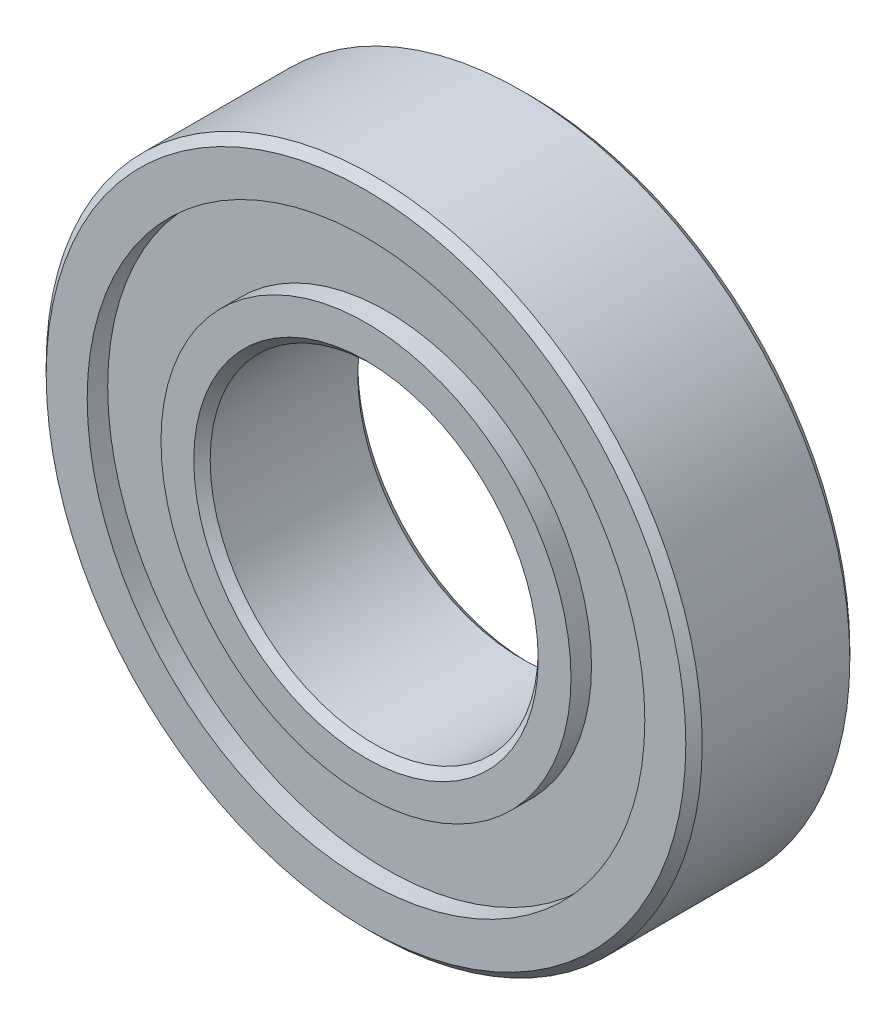
ISO-10303-21;
HEADER;
FILE_DESCRIPTION(('STEP AP214'),'2;1');
FILE_NAME('part.step','',(''),(''),'','','');
FILE_SCHEMA(('AUTOMOTIVE_DESIGN { 1 0 10303 214 1 1 1 1 }'));
ENDSEC;
DATA;
#1=APPLICATION_CONTEXT('core data for automotive mechanical design processes');
#2=APPLICATION_PROTOCOL_DEFINITION('international standard','automotive_design',2000,#1);
#3=PRODUCT_CONTEXT('',#1,'mechanical');
#4=PRODUCT('Part','Part','',(#3));
#5=PRODUCT_RELATED_PRODUCT_CATEGORY('part','',(#4));
#6=PRODUCT_DEFINITION_FORMATION('','',#4);
#7=PRODUCT_DEFINITION_CONTEXT('part definition',#1,'design');
#8=PRODUCT_DEFINITION('design','',#6,#7);
#9=PRODUCT_DEFINITION_SHAPE('','',#8);
#10=(LENGTH_UNIT() NAMED_UNIT(*) SI_UNIT(.MILLI.,.METRE.));
#11=(NAMED_UNIT(*) PLANE_ANGLE_UNIT() SI_UNIT($,.RADIAN.));
#12=(NAMED_UNIT(*) SI_UNIT($,.STERADIAN.) SOLID_ANGLE_UNIT());
#13=UNCERTAINTY_MEASURE_WITH_UNIT(LENGTH_MEASURE(1.E-05),#10,'distance_accuracy_value','');
#14=(GEOMETRIC_REPRESENTATION_CONTEXT(3) GLOBAL_UNCERTAINTY_ASSIGNED_CONTEXT((#13)) GLOBAL_UNIT_ASSIGNED_CONTEXT((#10,
#11,#12)) REPRESENTATION_CONTEXT('',''));
#15=CARTESIAN_POINT('',(0.,0.,0.));
#16=DIRECTION('',(0.,0.,1.));
#17=DIRECTION('',(1.,0.,0.));
#18=AXIS2_PLACEMENT_3D('',#15,#16,#17);
#19=CARTESIAN_POINT('',(0.,2.,-1.));
#20=DIRECTION('',(0.,0.,1.));
#21=DIRECTION('',(1.,0.,0.));
#22=AXIS2_PLACEMENT_3D('',#19,#20,#21);
#23=PLANE('',#22);
#24=CARTESIAN_POINT('',(0.,0.,-1.));
#25=DIRECTION('',(0.,0.,1.));
#26=DIRECTION('',(1.,0.,0.));
#27=AXIS2_PLACEMENT_3D('',#24,#25,#26);
#28=CIRCLE('',#27,2.1);
#29=CARTESIAN_POINT('',(2.1,0.,-1.));
#30=VERTEX_POINT('',#29);
#31=EDGE_CURVE('E74',#30,#30,#28,.T.);
#32=ORIENTED_EDGE('',*,*,#31,.T.);
#33=EDGE_LOOP('',(#32));
#34=FACE_BOUND('',#33,.T.);
#35=CARTESIAN_POINT('',(0.,0.,-1.));
#36=DIRECTION('',(0.,0.,1.));
#37=DIRECTION('',(1.,0.,0.));
#38=AXIS2_PLACEMENT_3D('',#35,#36,#37);
#39=CIRCLE('',#38,2.5);
#40=CARTESIAN_POINT('',(2.5,0.,-1.));
#41=VERTEX_POINT('',#40);
#42=EDGE_CURVE('E78',#41,#41,#39,.T.);
#43=ORIENTED_EDGE('',*,*,#42,.F.);
#44=EDGE_LOOP('',(#43));
#45=FACE_BOUND('',#44,.T.);
#46=ADVANCED_FACE('F38',(#34,#45),#23,.F.);
#47=CARTESIAN_POINT('',(0.,0.,11.8458465216965));
#48=DIRECTION('',(0.,0.,1.));
#49=DIRECTION('',(1.,0.,0.));
#50=AXIS2_PLACEMENT_3D('',#47,#48,#49);
#51=CYLINDRICAL_SURFACE('',#50,2.5);
#52=CARTESIAN_POINT('',(0.,0.,-0.750000000000002));
#53=DIRECTION('',(0.,0.,1.));
#54=DIRECTION('',(1.,0.,0.));
#55=AXIS2_PLACEMENT_3D('',#52,#53,#54);
#56=CIRCLE('',#55,2.5);
#57=CARTESIAN_POINT('',(2.5,0.,-0.750000000000002));
#58=VERTEX_POINT('',#57);
#59=EDGE_CURVE('E82',#58,#58,#56,.T.);
#60=ORIENTED_EDGE('',*,*,#59,.F.);
#61=EDGE_LOOP('',(#60));
#62=FACE_BOUND('',#61,.T.);
#63=ORIENTED_EDGE('',*,*,#42,.T.);
#64=EDGE_LOOP('',(#63));
#65=FACE_BOUND('',#64,.T.);
#66=ADVANCED_FACE('F142',(#62,#65),#51,.T.);
#67=CARTESIAN_POINT('',(0.,2.5,-0.750000000000002));
#68=DIRECTION('',(0.,0.,1.));
#69=DIRECTION('',(1.,0.,0.));
#70=AXIS2_PLACEMENT_3D('',#67,#68,#69);
#71=PLANE('',#70);
#72=CARTESIAN_POINT('',(0.,0.,-0.750000000000002));
#73=DIRECTION('',(0.,0.,1.));
#74=DIRECTION('',(1.,0.,0.));
#75=AXIS2_PLACEMENT_3D('',#72,#73,#74);
#76=CIRCLE('',#75,3.4);
#77=CARTESIAN_POINT('',(3.4,0.,-0.750000000000002));
#78=VERTEX_POINT('',#77);
#79=EDGE_CURVE('E86',#78,#78,#76,.T.);
#80=ORIENTED_EDGE('',*,*,#79,.F.);
#81=EDGE_LOOP('',(#80));
#82=FACE_BOUND('',#81,.T.);
#83=ORIENTED_EDGE('',*,*,#59,.T.);
#84=EDGE_LOOP('',(#83));
#85=FACE_BOUND('',#84,.T.);
#86=ADVANCED_FACE('F148',(#82,#85),#71,.F.);
#87=CARTESIAN_POINT('',(0.,0.,11.8458465216965));
#88=DIRECTION('',(0.,0.,1.));
#89=DIRECTION('',(1.,0.,0.));
#90=AXIS2_PLACEMENT_3D('',#87,#88,#89);
#91=CYLINDRICAL_SURFACE('',#90,3.4);
#92=CARTESIAN_POINT('',(0.,0.,-1.));
#93=DIRECTION('',(0.,0.,1.));
#94=DIRECTION('',(1.,0.,0.));
#95=AXIS2_PLACEMENT_3D('',#92,#93,#94);
#96=CIRCLE('',#95,3.4);
#97=CARTESIAN_POINT('',(3.4,0.,-1.));
#98=VERTEX_POINT('',#97);
#99=EDGE_CURVE('E90',#98,#98,#96,.T.);
#100=ORIENTED_EDGE('',*,*,#99,.F.);
#101=EDGE_LOOP('',(#100));
#102=FACE_BOUND('',#101,.T.);
#103=ORIENTED_EDGE('',*,*,#79,.T.);
#104=EDGE_LOOP('',(#103));
#105=FACE_BOUND('',#104,.T.);
#106=ADVANCED_FACE('F230',(#102,#105),#91,.F.);
#107=CARTESIAN_POINT('',(0.,3.4,-1.));
#108=DIRECTION('',(0.,0.,1.));
#109=DIRECTION('',(1.,0.,0.));
#110=AXIS2_PLACEMENT_3D('',#107,#108,#109);
#111=PLANE('',#110);
#112=CARTESIAN_POINT('',(0.,0.,-1.));
#113=DIRECTION('',(0.,0.,1.));
#114=DIRECTION('',(1.,0.,0.));
#115=AXIS2_PLACEMENT_3D('',#112,#113,#114);
#116=CIRCLE('',#115,3.9);
#117=CARTESIAN_POINT('',(3.9,0.,-1.));
#118=VERTEX_POINT('',#117);
#119=EDGE_CURVE('E46',#118,#118,#116,.F.);
#120=ORIENTED_EDGE('',*,*,#119,.T.);
#121=EDGE_LOOP('',(#120));
#122=FACE_BOUND('',#121,.T.);
#123=ORIENTED_EDGE('',*,*,#99,.T.);
#124=EDGE_LOOP('',(#123));
#125=FACE_BOUND('',#124,.T.);
#126=ADVANCED_FACE('F138',(#122,#125),#111,.F.);
#127=CARTESIAN_POINT('',(0.,0.,11.8458465216965));
#128=DIRECTION('',(0.,0.,1.));
#129=DIRECTION('',(1.,0.,0.));
#130=AXIS2_PLACEMENT_3D('',#127,#128,#129);
#131=CYLINDRICAL_SURFACE('',#130,4.);
#132=CARTESIAN_POINT('',(0.,0.,-0.900000000000003));
#133=DIRECTION('',(0.,0.,1.));
#134=DIRECTION('',(1.,0.,0.));
#135=AXIS2_PLACEMENT_3D('',#132,#133,#134);
#136=CIRCLE('',#135,4.);
#137=CARTESIAN_POINT('',(4.,0.,-0.900000000000003));
#138=VERTEX_POINT('',#137);
#139=EDGE_CURVE('E51',#138,#138,#136,.T.);
#140=ORIENTED_EDGE('',*,*,#139,.T.);
#141=EDGE_LOOP('',(#140));
#142=FACE_BOUND('',#141,.T.);
#143=CARTESIAN_POINT('',(0.,0.,0.900000000000003));
#144=DIRECTION('',(0.,0.,-1.));
#145=DIRECTION('',(-1.,0.,0.));
#146=AXIS2_PLACEMENT_3D('',#143,#144,#145);
#147=CIRCLE('',#146,4.);
#148=CARTESIAN_POINT('',(-4.,0.,0.900000000000003));
#149=VERTEX_POINT('',#148);
#150=EDGE_CURVE('E56',#149,#149,#147,.T.);
#151=ORIENTED_EDGE('',*,*,#150,.T.);
#152=EDGE_LOOP('',(#151));
#153=FACE_BOUND('',#152,.T.);
#154=ADVANCED_FACE('F133',(#142,#153),#131,.T.);
#155=CARTESIAN_POINT('',(0.,3.4,1.));
#156=DIRECTION('',(0.,0.,-1.));
#157=DIRECTION('',(-1.,0.,0.));
#158=AXIS2_PLACEMENT_3D('',#155,#156,#157);
#159=PLANE('',#158);
#160=CARTESIAN_POINT('',(0.,0.,1.));
#161=DIRECTION('',(0.,0.,-1.));
#162=DIRECTION('',(-1.,0.,0.));
#163=AXIS2_PLACEMENT_3D('',#160,#161,#162);
#164=CIRCLE('',#163,3.9);
#165=CARTESIAN_POINT('',(-3.9,0.,1.));
#166=VERTEX_POINT('',#165);
#167=EDGE_CURVE('E10',#166,#166,#164,.F.);
#168=ORIENTED_EDGE('',*,*,#167,.T.);
#169=EDGE_LOOP('',(#168));
#170=FACE_BOUND('',#169,.T.);
#171=CARTESIAN_POINT('',(0.,0.,1.));
#172=DIRECTION('',(0.,0.,1.));
#173=DIRECTION('',(1.,0.,0.));
#174=AXIS2_PLACEMENT_3D('',#171,#172,#173);
#175=CIRCLE('',#174,3.4);
#176=CARTESIAN_POINT('',(3.4,0.,1.));
#177=VERTEX_POINT('',#176);
#178=EDGE_CURVE('E94',#177,#177,#175,.T.);
#179=ORIENTED_EDGE('',*,*,#178,.F.);
#180=EDGE_LOOP('',(#179));
#181=FACE_BOUND('',#180,.T.);
#182=ADVANCED_FACE('F128',(#170,#181),#159,.F.);
#183=CARTESIAN_POINT('',(0.,0.,11.8458465216965));
#184=DIRECTION('',(0.,0.,1.));
#185=DIRECTION('',(1.,0.,0.));
#186=AXIS2_PLACEMENT_3D('',#183,#184,#185);
#187=CYLINDRICAL_SURFACE('',#186,3.4);
#188=CARTESIAN_POINT('',(0.,0.,0.750000000000002));
#189=DIRECTION('',(0.,0.,1.));
#190=DIRECTION('',(1.,0.,0.));
#191=AXIS2_PLACEMENT_3D('',#188,#189,#190);
#192=CIRCLE('',#191,3.4);
#193=CARTESIAN_POINT('',(3.4,0.,0.750000000000002));
#194=VERTEX_POINT('',#193);
#195=EDGE_CURVE('E98',#194,#194,#192,.T.);
#196=ORIENTED_EDGE('',*,*,#195,.F.);
#197=EDGE_LOOP('',(#196));
#198=FACE_BOUND('',#197,.T.);
#199=ORIENTED_EDGE('',*,*,#178,.T.);
#200=EDGE_LOOP('',(#199));
#201=FACE_BOUND('',#200,.T.);
#202=ADVANCED_FACE('F122',(#198,#201),#187,.F.);
#203=CARTESIAN_POINT('',(0.,2.5,0.750000000000002));
#204=DIRECTION('',(0.,0.,-1.));
#205=DIRECTION('',(-1.,0.,0.));
#206=AXIS2_PLACEMENT_3D('',#203,#204,#205);
#207=PLANE('',#206);
#208=CARTESIAN_POINT('',(0.,0.,0.750000000000002));
#209=DIRECTION('',(0.,0.,1.));
#210=DIRECTION('',(1.,0.,0.));
#211=AXIS2_PLACEMENT_3D('',#208,#209,#210);
#212=CIRCLE('',#211,2.5);
#213=CARTESIAN_POINT('',(2.5,0.,0.750000000000002));
#214=VERTEX_POINT('',#213);
#215=EDGE_CURVE('E102',#214,#214,#212,.T.);
#216=ORIENTED_EDGE('',*,*,#215,.F.);
#217=EDGE_LOOP('',(#216));
#218=FACE_BOUND('',#217,.T.);
#219=ORIENTED_EDGE('',*,*,#195,.T.);
#220=EDGE_LOOP('',(#219));
#221=FACE_BOUND('',#220,.T.);
#222=ADVANCED_FACE('F116',(#218,#221),#207,.F.);
#223=CARTESIAN_POINT('',(0.,0.,11.8458465216965));
#224=DIRECTION('',(0.,0.,1.));
#225=DIRECTION('',(1.,0.,0.));
#226=AXIS2_PLACEMENT_3D('',#223,#224,#225);
#227=CYLINDRICAL_SURFACE('',#226,2.5);
#228=CARTESIAN_POINT('',(0.,0.,1.));
#229=DIRECTION('',(0.,0.,1.));
#230=DIRECTION('',(1.,0.,0.));
#231=AXIS2_PLACEMENT_3D('',#228,#229,#230);
#232=CIRCLE('',#231,2.5);
#233=CARTESIAN_POINT('',(2.5,0.,1.));
#234=VERTEX_POINT('',#233);
#235=EDGE_CURVE('E106',#234,#234,#232,.T.);
#236=ORIENTED_EDGE('',*,*,#235,.F.);
#237=EDGE_LOOP('',(#236));
#238=FACE_BOUND('',#237,.T.);
#239=ORIENTED_EDGE('',*,*,#215,.T.);
#240=EDGE_LOOP('',(#239));
#241=FACE_BOUND('',#240,.T.);
#242=ADVANCED_FACE('F113',(#238,#241),#227,.T.);
#243=CARTESIAN_POINT('',(0.,2.,1.));
#244=DIRECTION('',(0.,0.,-1.));
#245=DIRECTION('',(-1.,0.,0.));
#246=AXIS2_PLACEMENT_3D('',#243,#244,#245);
#247=PLANE('',#246);
#248=CARTESIAN_POINT('',(0.,0.,1.));
#249=DIRECTION('',(0.,0.,-1.));
#250=DIRECTION('',(-1.,0.,0.));
#251=AXIS2_PLACEMENT_3D('',#248,#249,#250);
#252=CIRCLE('',#251,2.1);
#253=CARTESIAN_POINT('',(-2.1,0.,1.));
#254=VERTEX_POINT('',#253);
#255=EDGE_CURVE('E62',#254,#254,#252,.T.);
#256=ORIENTED_EDGE('',*,*,#255,.T.);
#257=EDGE_LOOP('',(#256));
#258=FACE_BOUND('',#257,.T.);
#259=ORIENTED_EDGE('',*,*,#235,.T.);
#260=EDGE_LOOP('',(#259));
#261=FACE_BOUND('',#260,.T.);
#262=ADVANCED_FACE('F111',(#258,#261),#247,.F.);
#263=CARTESIAN_POINT('',(0.,0.,11.8458465216965));
#264=DIRECTION('',(0.,0.,1.));
#265=DIRECTION('',(1.,0.,0.));
#266=AXIS2_PLACEMENT_3D('',#263,#264,#265);
#267=CYLINDRICAL_SURFACE('',#266,2.);
#268=CARTESIAN_POINT('',(0.,0.,-0.900000000000003));
#269=DIRECTION('',(0.,0.,1.));
#270=DIRECTION('',(1.,0.,0.));
#271=AXIS2_PLACEMENT_3D('',#268,#269,#270);
#272=CIRCLE('',#271,2.);
#273=CARTESIAN_POINT('',(2.,0.,-0.900000000000003));
#274=VERTEX_POINT('',#273);
#275=EDGE_CURVE('E66',#274,#274,#272,.F.);
#276=ORIENTED_EDGE('',*,*,#275,.T.);
#277=EDGE_LOOP('',(#276));
#278=FACE_BOUND('',#277,.T.);
#279=CARTESIAN_POINT('',(0.,0.,0.900000000000003));
#280=DIRECTION('',(0.,0.,-1.));
#281=DIRECTION('',(-1.,0.,0.));
#282=AXIS2_PLACEMENT_3D('',#279,#280,#281);
#283=CIRCLE('',#282,2.);
#284=CARTESIAN_POINT('',(-2.,0.,0.900000000000003));
#285=VERTEX_POINT('',#284);
#286=EDGE_CURVE('E70',#285,#285,#283,.F.);
#287=ORIENTED_EDGE('',*,*,#286,.T.);
#288=EDGE_LOOP('',(#287));
#289=FACE_BOUND('',#288,.T.);
#290=ADVANCED_FACE('F158',(#278,#289),#267,.F.);
#291=CARTESIAN_POINT('',(0.,0.,-1.));
#292=DIRECTION('',(0.,0.,-1.));
#293=DIRECTION('',(-1.,0.,0.));
#294=AXIS2_PLACEMENT_3D('',#291,#292,#293);
#295=CONICAL_SURFACE('',#294,2.1,0.785398163397448);
#296=ORIENTED_EDGE('',*,*,#275,.F.);
#297=EDGE_LOOP('',(#296));
#298=FACE_BOUND('',#297,.T.);
#299=ORIENTED_EDGE('',*,*,#31,.F.);
#300=EDGE_LOOP('',(#299));
#301=FACE_BOUND('',#300,.T.);
#302=ADVANCED_FACE('F154',(#298,#301),#295,.F.);
#303=CARTESIAN_POINT('',(0.,0.,0.900000000000003));
#304=DIRECTION('',(0.,0.,1.));
#305=DIRECTION('',(1.,0.,0.));
#306=AXIS2_PLACEMENT_3D('',#303,#304,#305);
#307=CONICAL_SURFACE('',#306,2.,0.785398163397448);
#308=ORIENTED_EDGE('',*,*,#255,.F.);
#309=EDGE_LOOP('',(#308));
#310=FACE_BOUND('',#309,.T.);
#311=ORIENTED_EDGE('',*,*,#286,.F.);
#312=EDGE_LOOP('',(#311));
#313=FACE_BOUND('',#312,.T.);
#314=ADVANCED_FACE('F157',(#310,#313),#307,.F.);
#315=CARTESIAN_POINT('',(0.,0.,-0.900000000000003));
#316=DIRECTION('',(0.,0.,1.));
#317=DIRECTION('',(1.,0.,0.));
#318=AXIS2_PLACEMENT_3D('',#315,#316,#317);
#319=CONICAL_SURFACE('',#318,4.,0.785398163397444);
#320=ORIENTED_EDGE('',*,*,#119,.F.);
#321=EDGE_LOOP('',(#320));
#322=FACE_BOUND('',#321,.T.);
#323=ORIENTED_EDGE('',*,*,#139,.F.);
#324=EDGE_LOOP('',(#323));
#325=FACE_BOUND('',#324,.T.);
#326=ADVANCED_FACE('F161',(#322,#325),#319,.T.);
#327=CARTESIAN_POINT('',(0.,0.,1.));
#328=DIRECTION('',(0.,0.,-1.));
#329=DIRECTION('',(-1.,0.,0.));
#330=AXIS2_PLACEMENT_3D('',#327,#328,#329);
#331=CONICAL_SURFACE('',#330,3.9,0.785398163397448);
#332=ORIENTED_EDGE('',*,*,#150,.F.);
#333=EDGE_LOOP('',(#332));
#334=FACE_BOUND('',#333,.T.);
#335=ORIENTED_EDGE('',*,*,#167,.F.);
#336=EDGE_LOOP('',(#335));
#337=FACE_BOUND('',#336,.T.);
#338=ADVANCED_FACE('F40',(#334,#337),#331,.T.);
#339=CLOSED_SHELL('',(#46,#66,#86,#106,#126,#154,#182,#202,#222,#242,#262,#290,#302,#314,#326,#338));
#340=MANIFOLD_SOLID_BREP('B2',#339);
#341=ADVANCED_BREP_SHAPE_REPRESENTATION('',(#18,#340),#14);
#342=SHAPE_DEFINITION_REPRESENTATION(#9,#341);
ENDSEC;
END-ISO-10303-21;
